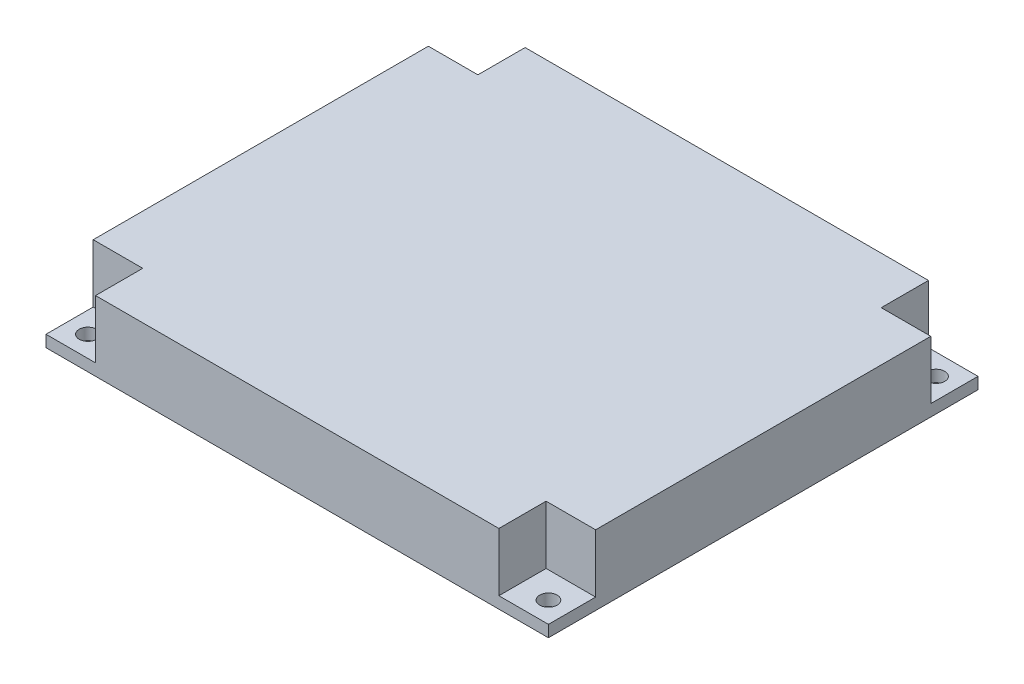
ISO-10303-21;
HEADER;
FILE_DESCRIPTION(('STEP AP214'),'2;1');
FILE_NAME('part.step','',(''),(''),'','','');
FILE_SCHEMA(('AUTOMOTIVE_DESIGN { 1 0 10303 214 1 1 1 1 }'));
ENDSEC;
DATA;
#1=APPLICATION_CONTEXT('core data for automotive mechanical design processes');
#2=APPLICATION_PROTOCOL_DEFINITION('international standard','automotive_design',2000,#1);
#3=PRODUCT_CONTEXT('',#1,'mechanical');
#4=PRODUCT('Part','Part','',(#3));
#5=PRODUCT_RELATED_PRODUCT_CATEGORY('part','',(#4));
#6=PRODUCT_DEFINITION_FORMATION('','',#4);
#7=PRODUCT_DEFINITION_CONTEXT('part definition',#1,'design');
#8=PRODUCT_DEFINITION('design','',#6,#7);
#9=PRODUCT_DEFINITION_SHAPE('','',#8);
#10=(LENGTH_UNIT() NAMED_UNIT(*) SI_UNIT(.MILLI.,.METRE.));
#11=(NAMED_UNIT(*) PLANE_ANGLE_UNIT() SI_UNIT($,.RADIAN.));
#12=(NAMED_UNIT(*) SI_UNIT($,.STERADIAN.) SOLID_ANGLE_UNIT());
#13=UNCERTAINTY_MEASURE_WITH_UNIT(LENGTH_MEASURE(1.E-05),#10,'distance_accuracy_value','');
#14=(GEOMETRIC_REPRESENTATION_CONTEXT(3) GLOBAL_UNCERTAINTY_ASSIGNED_CONTEXT((#13)) GLOBAL_UNIT_ASSIGNED_CONTEXT((#10,
#11,#12)) REPRESENTATION_CONTEXT('',''));
#15=CARTESIAN_POINT('',(0.,0.,0.));
#16=DIRECTION('',(0.,0.,1.));
#17=DIRECTION('',(1.,0.,0.));
#18=AXIS2_PLACEMENT_3D('',#15,#16,#17);
#19=CARTESIAN_POINT('',(0.,2.,0.));
#20=DIRECTION('',(0.,1.,0.));
#21=DIRECTION('',(0.,0.,1.));
#22=AXIS2_PLACEMENT_3D('',#19,#20,#21);
#23=PLANE('',#22);
#24=DIRECTION('',(0.,0.,1.));
#25=VECTOR('',#24,1.);
#26=CARTESIAN_POINT('',(-34.6,2.,28.75));
#27=LINE('',#26,#25);
#28=CARTESIAN_POINT('',(-34.6,2.,28.75));
#29=VERTEX_POINT('',#28);
#30=CARTESIAN_POINT('',(-34.6,2.,36.85));
#31=VERTEX_POINT('',#30);
#32=EDGE_CURVE('E50',#29,#31,#27,.T.);
#33=ORIENTED_EDGE('',*,*,#32,.F.);
#34=DIRECTION('',(1.,0.,0.));
#35=VECTOR('',#34,1.);
#36=CARTESIAN_POINT('',(-43.1,2.,28.75));
#37=LINE('',#36,#35);
#38=CARTESIAN_POINT('',(-43.1,2.,28.75));
#39=VERTEX_POINT('',#38);
#40=EDGE_CURVE('E267',#39,#29,#37,.T.);
#41=ORIENTED_EDGE('',*,*,#40,.F.);
#42=DIRECTION('',(0.,0.,1.));
#43=VECTOR('',#42,1.);
#44=CARTESIAN_POINT('',(-43.1,2.,-36.85));
#45=LINE('',#44,#43);
#46=CARTESIAN_POINT('',(-43.1,2.,36.85));
#47=VERTEX_POINT('',#46);
#48=EDGE_CURVE('E208',#39,#47,#45,.T.);
#49=ORIENTED_EDGE('',*,*,#48,.T.);
#50=DIRECTION('',(1.,0.,0.));
#51=VECTOR('',#50,1.);
#52=CARTESIAN_POINT('',(-43.1,2.,36.85));
#53=LINE('',#52,#51);
#54=EDGE_CURVE('E212',#47,#31,#53,.T.);
#55=ORIENTED_EDGE('',*,*,#54,.T.);
#56=EDGE_LOOP('',(#33,#41,#49,#55));
#57=FACE_BOUND('',#56,.T.);
#58=CARTESIAN_POINT('',(-39.5,2.,33.25));
#59=DIRECTION('',(0.,1.,0.));
#60=DIRECTION('',(0.,0.,1.));
#61=AXIS2_PLACEMENT_3D('',#58,#59,#60);
#62=CIRCLE('',#61,1.5);
#63=CARTESIAN_POINT('',(-39.5,2.,34.75));
#64=VERTEX_POINT('',#63);
#65=EDGE_CURVE('E184',#64,#64,#62,.T.);
#66=ORIENTED_EDGE('',*,*,#65,.F.);
#67=EDGE_LOOP('',(#66));
#68=FACE_BOUND('',#67,.T.);
#69=ADVANCED_FACE('F35',(#57,#68),#23,.T.);
#70=DIRECTION('',(-1.,0.,0.));
#71=VECTOR('',#70,1.);
#72=CARTESIAN_POINT('',(-43.1,2.,-28.75));
#73=LINE('',#72,#71);
#74=CARTESIAN_POINT('',(-34.6,2.,-28.75));
#75=VERTEX_POINT('',#74);
#76=CARTESIAN_POINT('',(-43.1,2.,-28.75));
#77=VERTEX_POINT('',#76);
#78=EDGE_CURVE('E58',#75,#77,#73,.T.);
#79=ORIENTED_EDGE('',*,*,#78,.F.);
#80=DIRECTION('',(0.,0.,1.));
#81=VECTOR('',#80,1.);
#82=CARTESIAN_POINT('',(-34.6,2.,-36.85));
#83=LINE('',#82,#81);
#84=CARTESIAN_POINT('',(-34.6,2.,-36.85));
#85=VERTEX_POINT('',#84);
#86=EDGE_CURVE('E264',#85,#75,#83,.T.);
#87=ORIENTED_EDGE('',*,*,#86,.F.);
#88=DIRECTION('',(-1.,0.,0.));
#89=VECTOR('',#88,1.);
#90=CARTESIAN_POINT('',(-43.1,2.,-36.85));
#91=LINE('',#90,#89);
#92=CARTESIAN_POINT('',(-43.1,2.,-36.85));
#93=VERTEX_POINT('',#92);
#94=EDGE_CURVE('E204',#85,#93,#91,.T.);
#95=ORIENTED_EDGE('',*,*,#94,.T.);
#96=EDGE_CURVE('E209',#93,#77,#45,.T.);
#97=ORIENTED_EDGE('',*,*,#96,.T.);
#98=EDGE_LOOP('',(#79,#87,#95,#97));
#99=FACE_BOUND('',#98,.T.);
#100=CARTESIAN_POINT('',(-39.5,2.,-33.25));
#101=DIRECTION('',(0.,1.,0.));
#102=DIRECTION('',(0.,0.,1.));
#103=AXIS2_PLACEMENT_3D('',#100,#101,#102);
#104=CIRCLE('',#103,1.5);
#105=CARTESIAN_POINT('',(-39.5,2.,-31.75));
#106=VERTEX_POINT('',#105);
#107=EDGE_CURVE('E196',#106,#106,#104,.T.);
#108=ORIENTED_EDGE('',*,*,#107,.F.);
#109=EDGE_LOOP('',(#108));
#110=FACE_BOUND('',#109,.T.);
#111=ADVANCED_FACE('F353',(#99,#110),#23,.T.);
#112=DIRECTION('',(0.,0.,-1.));
#113=VECTOR('',#112,1.);
#114=CARTESIAN_POINT('',(34.6,2.,-36.85));
#115=LINE('',#114,#113);
#116=CARTESIAN_POINT('',(34.6,2.,-28.75));
#117=VERTEX_POINT('',#116);
#118=CARTESIAN_POINT('',(34.6,2.,-36.85));
#119=VERTEX_POINT('',#118);
#120=EDGE_CURVE('E257',#117,#119,#115,.T.);
#121=ORIENTED_EDGE('',*,*,#120,.F.);
#122=DIRECTION('',(-1.,0.,0.));
#123=VECTOR('',#122,1.);
#124=CARTESIAN_POINT('',(34.6,2.,-28.75));
#125=LINE('',#124,#123);
#126=CARTESIAN_POINT('',(43.1,2.,-28.75));
#127=VERTEX_POINT('',#126);
#128=EDGE_CURVE('E254',#127,#117,#125,.T.);
#129=ORIENTED_EDGE('',*,*,#128,.F.);
#130=DIRECTION('',(0.,0.,-1.));
#131=VECTOR('',#130,1.);
#132=CARTESIAN_POINT('',(43.1,2.,-36.85));
#133=LINE('',#132,#131);
#134=CARTESIAN_POINT('',(43.1,2.,-36.85));
#135=VERTEX_POINT('',#134);
#136=EDGE_CURVE('E205',#127,#135,#133,.T.);
#137=ORIENTED_EDGE('',*,*,#136,.T.);
#138=EDGE_CURVE('E206',#135,#119,#91,.T.);
#139=ORIENTED_EDGE('',*,*,#138,.T.);
#140=EDGE_LOOP('',(#121,#129,#137,#139));
#141=FACE_BOUND('',#140,.T.);
#142=CARTESIAN_POINT('',(39.5,2.,-33.25));
#143=DIRECTION('',(0.,1.,0.));
#144=DIRECTION('',(0.,0.,1.));
#145=AXIS2_PLACEMENT_3D('',#142,#143,#144);
#146=CIRCLE('',#145,1.5);
#147=CARTESIAN_POINT('',(39.5,2.,-31.75));
#148=VERTEX_POINT('',#147);
#149=EDGE_CURVE('E190',#148,#148,#146,.T.);
#150=ORIENTED_EDGE('',*,*,#149,.F.);
#151=EDGE_LOOP('',(#150));
#152=FACE_BOUND('',#151,.T.);
#153=ADVANCED_FACE('F304',(#141,#152),#23,.T.);
#154=DIRECTION('',(0.,0.,-1.));
#155=VECTOR('',#154,1.);
#156=CARTESIAN_POINT('',(34.6,2.,28.75));
#157=LINE('',#156,#155);
#158=CARTESIAN_POINT('',(34.6,2.,36.85));
#159=VERTEX_POINT('',#158);
#160=CARTESIAN_POINT('',(34.6,2.,28.75));
#161=VERTEX_POINT('',#160);
#162=EDGE_CURVE('E171',#159,#161,#157,.T.);
#163=ORIENTED_EDGE('',*,*,#162,.F.);
#164=CARTESIAN_POINT('',(43.1,2.,36.85));
#165=VERTEX_POINT('',#164);
#166=EDGE_CURVE('E211',#159,#165,#53,.T.);
#167=ORIENTED_EDGE('',*,*,#166,.T.);
#168=CARTESIAN_POINT('',(43.1,2.,28.75));
#169=VERTEX_POINT('',#168);
#170=EDGE_CURVE('E202',#165,#169,#133,.T.);
#171=ORIENTED_EDGE('',*,*,#170,.T.);
#172=DIRECTION('',(1.,0.,0.));
#173=VECTOR('',#172,1.);
#174=CARTESIAN_POINT('',(34.6,2.,28.75));
#175=LINE('',#174,#173);
#176=EDGE_CURVE('E253',#161,#169,#175,.T.);
#177=ORIENTED_EDGE('',*,*,#176,.F.);
#178=EDGE_LOOP('',(#163,#167,#171,#177));
#179=FACE_BOUND('',#178,.T.);
#180=CARTESIAN_POINT('',(39.5,2.,33.25));
#181=DIRECTION('',(0.,1.,0.));
#182=DIRECTION('',(0.,0.,1.));
#183=AXIS2_PLACEMENT_3D('',#180,#181,#182);
#184=CIRCLE('',#183,1.5);
#185=CARTESIAN_POINT('',(39.5,2.,34.75));
#186=VERTEX_POINT('',#185);
#187=EDGE_CURVE('E175',#186,#186,#184,.T.);
#188=ORIENTED_EDGE('',*,*,#187,.F.);
#189=EDGE_LOOP('',(#188));
#190=FACE_BOUND('',#189,.T.);
#191=ADVANCED_FACE('F251',(#179,#190),#23,.T.);
#192=CARTESIAN_POINT('',(0.,0.,0.));
#193=DIRECTION('',(0.,1.,0.));
#194=DIRECTION('',(0.,0.,1.));
#195=AXIS2_PLACEMENT_3D('',#192,#193,#194);
#196=PLANE('',#195);
#197=DIRECTION('',(0.,0.,-1.));
#198=VECTOR('',#197,1.);
#199=CARTESIAN_POINT('',(43.1,0.,-36.85));
#200=LINE('',#199,#198);
#201=CARTESIAN_POINT('',(43.1,0.,36.85));
#202=VERTEX_POINT('',#201);
#203=CARTESIAN_POINT('',(43.1,0.,-36.85));
#204=VERTEX_POINT('',#203);
#205=EDGE_CURVE('E199',#202,#204,#200,.T.);
#206=ORIENTED_EDGE('',*,*,#205,.F.);
#207=DIRECTION('',(1.,0.,0.));
#208=VECTOR('',#207,1.);
#209=CARTESIAN_POINT('',(-43.1,0.,36.85));
#210=LINE('',#209,#208);
#211=CARTESIAN_POINT('',(-43.1,0.,36.85));
#212=VERTEX_POINT('',#211);
#213=EDGE_CURVE('E221',#212,#202,#210,.T.);
#214=ORIENTED_EDGE('',*,*,#213,.F.);
#215=DIRECTION('',(0.,0.,1.));
#216=VECTOR('',#215,1.);
#217=CARTESIAN_POINT('',(-43.1,0.,-36.85));
#218=LINE('',#217,#216);
#219=CARTESIAN_POINT('',(-43.1,0.,-36.85));
#220=VERTEX_POINT('',#219);
#221=EDGE_CURVE('E219',#220,#212,#218,.T.);
#222=ORIENTED_EDGE('',*,*,#221,.F.);
#223=DIRECTION('',(-1.,0.,0.));
#224=VECTOR('',#223,1.);
#225=CARTESIAN_POINT('',(-43.1,0.,-36.85));
#226=LINE('',#225,#224);
#227=EDGE_CURVE('E217',#204,#220,#226,.T.);
#228=ORIENTED_EDGE('',*,*,#227,.F.);
#229=EDGE_LOOP('',(#206,#214,#222,#228));
#230=FACE_BOUND('',#229,.T.);
#231=CARTESIAN_POINT('',(-39.5,0.,-33.25));
#232=DIRECTION('',(0.,1.,0.));
#233=DIRECTION('',(0.,0.,1.));
#234=AXIS2_PLACEMENT_3D('',#231,#232,#233);
#235=CIRCLE('',#234,1.5);
#236=CARTESIAN_POINT('',(-39.5,0.,-31.75));
#237=VERTEX_POINT('',#236);
#238=EDGE_CURVE('E193',#237,#237,#235,.T.);
#239=ORIENTED_EDGE('',*,*,#238,.T.);
#240=EDGE_LOOP('',(#239));
#241=FACE_BOUND('',#240,.T.);
#242=CARTESIAN_POINT('',(39.5,0.,-33.25));
#243=DIRECTION('',(0.,1.,0.));
#244=DIRECTION('',(0.,0.,1.));
#245=AXIS2_PLACEMENT_3D('',#242,#243,#244);
#246=CIRCLE('',#245,1.5);
#247=CARTESIAN_POINT('',(39.5,0.,-31.75));
#248=VERTEX_POINT('',#247);
#249=EDGE_CURVE('E187',#248,#248,#246,.T.);
#250=ORIENTED_EDGE('',*,*,#249,.T.);
#251=EDGE_LOOP('',(#250));
#252=FACE_BOUND('',#251,.T.);
#253=CARTESIAN_POINT('',(-39.5,0.,33.25));
#254=DIRECTION('',(0.,1.,0.));
#255=DIRECTION('',(0.,0.,1.));
#256=AXIS2_PLACEMENT_3D('',#253,#254,#255);
#257=CIRCLE('',#256,1.5);
#258=CARTESIAN_POINT('',(-39.5,0.,34.75));
#259=VERTEX_POINT('',#258);
#260=EDGE_CURVE('E182',#259,#259,#257,.T.);
#261=ORIENTED_EDGE('',*,*,#260,.T.);
#262=EDGE_LOOP('',(#261));
#263=FACE_BOUND('',#262,.T.);
#264=CARTESIAN_POINT('',(39.5,0.,33.25));
#265=DIRECTION('',(0.,1.,0.));
#266=DIRECTION('',(0.,0.,1.));
#267=AXIS2_PLACEMENT_3D('',#264,#265,#266);
#268=CIRCLE('',#267,1.5);
#269=CARTESIAN_POINT('',(39.5,0.,34.75));
#270=VERTEX_POINT('',#269);
#271=EDGE_CURVE('E172',#270,#270,#268,.T.);
#272=ORIENTED_EDGE('',*,*,#271,.T.);
#273=EDGE_LOOP('',(#272));
#274=FACE_BOUND('',#273,.T.);
#275=ADVANCED_FACE('F240',(#230,#241,#252,#263,#274),#196,.F.);
#276=CARTESIAN_POINT('',(43.1,2.,-36.85));
#277=DIRECTION('',(-1.,0.,0.));
#278=DIRECTION('',(0.,0.,1.));
#279=AXIS2_PLACEMENT_3D('',#276,#277,#278);
#280=PLANE('',#279);
#281=ORIENTED_EDGE('',*,*,#205,.T.);
#282=DIRECTION('',(0.,-1.,0.));
#283=VECTOR('',#282,1.);
#284=CARTESIAN_POINT('',(43.1,2.,-36.85));
#285=LINE('',#284,#283);
#286=EDGE_CURVE('E11',#135,#204,#285,.T.);
#287=ORIENTED_EDGE('',*,*,#286,.F.);
#288=ORIENTED_EDGE('',*,*,#136,.F.);
#289=DIRECTION('',(0.,-1.,0.));
#290=VECTOR('',#289,1.);
#291=CARTESIAN_POINT('',(43.1,12.,-28.75));
#292=LINE('',#291,#290);
#293=CARTESIAN_POINT('',(43.1,12.,-28.75));
#294=VERTEX_POINT('',#293);
#295=EDGE_CURVE('E177',#294,#127,#292,.T.);
#296=ORIENTED_EDGE('',*,*,#295,.F.);
#297=DIRECTION('',(0.,0.,-1.));
#298=VECTOR('',#297,1.);
#299=CARTESIAN_POINT('',(43.1,12.,-28.75));
#300=LINE('',#299,#298);
#301=CARTESIAN_POINT('',(43.1,12.,28.75));
#302=VERTEX_POINT('',#301);
#303=EDGE_CURVE('E159',#302,#294,#300,.T.);
#304=ORIENTED_EDGE('',*,*,#303,.F.);
#305=DIRECTION('',(0.,-1.,0.));
#306=VECTOR('',#305,1.);
#307=CARTESIAN_POINT('',(43.1,12.,28.75));
#308=LINE('',#307,#306);
#309=EDGE_CURVE('E156',#302,#169,#308,.T.);
#310=ORIENTED_EDGE('',*,*,#309,.T.);
#311=ORIENTED_EDGE('',*,*,#170,.F.);
#312=DIRECTION('',(0.,-1.,0.));
#313=VECTOR('',#312,1.);
#314=CARTESIAN_POINT('',(43.1,2.,36.85));
#315=LINE('',#314,#313);
#316=EDGE_CURVE('E214',#165,#202,#315,.T.);
#317=ORIENTED_EDGE('',*,*,#316,.T.);
#318=EDGE_LOOP('',(#281,#287,#288,#296,#304,#310,#311,#317));
#319=FACE_BOUND('',#318,.T.);
#320=ADVANCED_FACE('F37',(#319),#280,.F.);
#321=CARTESIAN_POINT('',(-43.1,2.,-36.85));
#322=DIRECTION('',(0.,0.,1.));
#323=DIRECTION('',(1.,0.,0.));
#324=AXIS2_PLACEMENT_3D('',#321,#322,#323);
#325=PLANE('',#324);
#326=ORIENTED_EDGE('',*,*,#227,.T.);
#327=DIRECTION('',(0.,-1.,0.));
#328=VECTOR('',#327,1.);
#329=CARTESIAN_POINT('',(-43.1,2.,-36.85));
#330=LINE('',#329,#328);
#331=EDGE_CURVE('E43',#93,#220,#330,.T.);
#332=ORIENTED_EDGE('',*,*,#331,.F.);
#333=ORIENTED_EDGE('',*,*,#94,.F.);
#334=DIRECTION('',(0.,-1.,0.));
#335=VECTOR('',#334,1.);
#336=CARTESIAN_POINT('',(-34.6,12.,-36.85));
#337=LINE('',#336,#335);
#338=CARTESIAN_POINT('',(-34.6,12.,-36.85));
#339=VERTEX_POINT('',#338);
#340=EDGE_CURVE('E286',#339,#85,#337,.T.);
#341=ORIENTED_EDGE('',*,*,#340,.F.);
#342=DIRECTION('',(-1.,0.,0.));
#343=VECTOR('',#342,1.);
#344=CARTESIAN_POINT('',(-34.6,12.,-36.85));
#345=LINE('',#344,#343);
#346=CARTESIAN_POINT('',(34.6,12.,-36.85));
#347=VERTEX_POINT('',#346);
#348=EDGE_CURVE('E310',#347,#339,#345,.T.);
#349=ORIENTED_EDGE('',*,*,#348,.F.);
#350=DIRECTION('',(0.,-1.,0.));
#351=VECTOR('',#350,1.);
#352=CARTESIAN_POINT('',(34.6,12.,-36.85));
#353=LINE('',#352,#351);
#354=EDGE_CURVE('E289',#347,#119,#353,.T.);
#355=ORIENTED_EDGE('',*,*,#354,.T.);
#356=ORIENTED_EDGE('',*,*,#138,.F.);
#357=ORIENTED_EDGE('',*,*,#286,.T.);
#358=EDGE_LOOP('',(#326,#332,#333,#341,#349,#355,#356,#357));
#359=FACE_BOUND('',#358,.T.);
#360=ADVANCED_FACE('F306',(#359),#325,.F.);
#361=CARTESIAN_POINT('',(-43.1,2.,-36.85));
#362=DIRECTION('',(1.,0.,0.));
#363=DIRECTION('',(0.,0.,-1.));
#364=AXIS2_PLACEMENT_3D('',#361,#362,#363);
#365=PLANE('',#364);
#366=ORIENTED_EDGE('',*,*,#221,.T.);
#367=DIRECTION('',(0.,-1.,0.));
#368=VECTOR('',#367,1.);
#369=CARTESIAN_POINT('',(-43.1,2.,36.85));
#370=LINE('',#369,#368);
#371=EDGE_CURVE('E225',#47,#212,#370,.T.);
#372=ORIENTED_EDGE('',*,*,#371,.F.);
#373=ORIENTED_EDGE('',*,*,#48,.F.);
#374=DIRECTION('',(0.,-1.,0.));
#375=VECTOR('',#374,1.);
#376=CARTESIAN_POINT('',(-43.1,12.,28.75));
#377=LINE('',#376,#375);
#378=CARTESIAN_POINT('',(-43.1,12.,28.75));
#379=VERTEX_POINT('',#378);
#380=EDGE_CURVE('E278',#379,#39,#377,.T.);
#381=ORIENTED_EDGE('',*,*,#380,.F.);
#382=DIRECTION('',(0.,0.,1.));
#383=VECTOR('',#382,1.);
#384=CARTESIAN_POINT('',(-43.1,12.,-28.75));
#385=LINE('',#384,#383);
#386=CARTESIAN_POINT('',(-43.1,12.,-28.75));
#387=VERTEX_POINT('',#386);
#388=EDGE_CURVE('E324',#387,#379,#385,.T.);
#389=ORIENTED_EDGE('',*,*,#388,.F.);
#390=DIRECTION('',(0.,-1.,0.));
#391=VECTOR('',#390,1.);
#392=CARTESIAN_POINT('',(-43.1,12.,-28.75));
#393=LINE('',#392,#391);
#394=EDGE_CURVE('E281',#387,#77,#393,.T.);
#395=ORIENTED_EDGE('',*,*,#394,.T.);
#396=ORIENTED_EDGE('',*,*,#96,.F.);
#397=ORIENTED_EDGE('',*,*,#331,.T.);
#398=EDGE_LOOP('',(#366,#372,#373,#381,#389,#395,#396,#397));
#399=FACE_BOUND('',#398,.T.);
#400=ADVANCED_FACE('F232',(#399),#365,.F.);
#401=CARTESIAN_POINT('',(-43.1,2.,36.85));
#402=DIRECTION('',(0.,0.,-1.));
#403=DIRECTION('',(-1.,0.,0.));
#404=AXIS2_PLACEMENT_3D('',#401,#402,#403);
#405=PLANE('',#404);
#406=ORIENTED_EDGE('',*,*,#213,.T.);
#407=ORIENTED_EDGE('',*,*,#316,.F.);
#408=ORIENTED_EDGE('',*,*,#166,.F.);
#409=DIRECTION('',(0.,-1.,0.));
#410=VECTOR('',#409,1.);
#411=CARTESIAN_POINT('',(34.6,12.,36.85));
#412=LINE('',#411,#410);
#413=CARTESIAN_POINT('',(34.6,12.,36.85));
#414=VERTEX_POINT('',#413);
#415=EDGE_CURVE('E270',#414,#159,#412,.T.);
#416=ORIENTED_EDGE('',*,*,#415,.F.);
#417=DIRECTION('',(1.,0.,0.));
#418=VECTOR('',#417,1.);
#419=CARTESIAN_POINT('',(-34.6,12.,36.85));
#420=LINE('',#419,#418);
#421=CARTESIAN_POINT('',(-34.6,12.,36.85));
#422=VERTEX_POINT('',#421);
#423=EDGE_CURVE('E165',#422,#414,#420,.T.);
#424=ORIENTED_EDGE('',*,*,#423,.F.);
#425=DIRECTION('',(0.,-1.,0.));
#426=VECTOR('',#425,1.);
#427=CARTESIAN_POINT('',(-34.6,12.,36.85));
#428=LINE('',#427,#426);
#429=EDGE_CURVE('E272',#422,#31,#428,.T.);
#430=ORIENTED_EDGE('',*,*,#429,.T.);
#431=ORIENTED_EDGE('',*,*,#54,.F.);
#432=ORIENTED_EDGE('',*,*,#371,.T.);
#433=EDGE_LOOP('',(#406,#407,#408,#416,#424,#430,#431,#432));
#434=FACE_BOUND('',#433,.T.);
#435=ADVANCED_FACE('F244',(#434),#405,.F.);
#436=CARTESIAN_POINT('',(-39.5,2.,-33.25));
#437=DIRECTION('',(0.,-1.,0.));
#438=DIRECTION('',(0.,0.,-1.));
#439=AXIS2_PLACEMENT_3D('',#436,#437,#438);
#440=CYLINDRICAL_SURFACE('',#439,1.5);
#441=ORIENTED_EDGE('',*,*,#107,.T.);
#442=EDGE_LOOP('',(#441));
#443=FACE_BOUND('',#442,.T.);
#444=ORIENTED_EDGE('',*,*,#238,.F.);
#445=EDGE_LOOP('',(#444));
#446=FACE_BOUND('',#445,.T.);
#447=ADVANCED_FACE('F407',(#443,#446),#440,.F.);
#448=CARTESIAN_POINT('',(39.5,2.,-33.25));
#449=DIRECTION('',(0.,-1.,0.));
#450=DIRECTION('',(0.,0.,-1.));
#451=AXIS2_PLACEMENT_3D('',#448,#449,#450);
#452=CYLINDRICAL_SURFACE('',#451,1.5);
#453=ORIENTED_EDGE('',*,*,#149,.T.);
#454=EDGE_LOOP('',(#453));
#455=FACE_BOUND('',#454,.T.);
#456=ORIENTED_EDGE('',*,*,#249,.F.);
#457=EDGE_LOOP('',(#456));
#458=FACE_BOUND('',#457,.T.);
#459=ADVANCED_FACE('F397',(#455,#458),#452,.F.);
#460=CARTESIAN_POINT('',(-39.5,2.,33.25));
#461=DIRECTION('',(0.,-1.,0.));
#462=DIRECTION('',(0.,0.,-1.));
#463=AXIS2_PLACEMENT_3D('',#460,#461,#462);
#464=CYLINDRICAL_SURFACE('',#463,1.5);
#465=ORIENTED_EDGE('',*,*,#65,.T.);
#466=EDGE_LOOP('',(#465));
#467=FACE_BOUND('',#466,.T.);
#468=ORIENTED_EDGE('',*,*,#260,.F.);
#469=EDGE_LOOP('',(#468));
#470=FACE_BOUND('',#469,.T.);
#471=ADVANCED_FACE('F386',(#467,#470),#464,.F.);
#472=CARTESIAN_POINT('',(39.5,2.,33.25));
#473=DIRECTION('',(0.,-1.,0.));
#474=DIRECTION('',(0.,0.,-1.));
#475=AXIS2_PLACEMENT_3D('',#472,#473,#474);
#476=CYLINDRICAL_SURFACE('',#475,1.5);
#477=ORIENTED_EDGE('',*,*,#187,.T.);
#478=EDGE_LOOP('',(#477));
#479=FACE_BOUND('',#478,.T.);
#480=ORIENTED_EDGE('',*,*,#271,.F.);
#481=EDGE_LOOP('',(#480));
#482=FACE_BOUND('',#481,.T.);
#483=ADVANCED_FACE('F381',(#479,#482),#476,.F.);
#484=CARTESIAN_POINT('',(34.6,12.,28.75));
#485=DIRECTION('',(-1.,0.,0.));
#486=DIRECTION('',(0.,0.,1.));
#487=AXIS2_PLACEMENT_3D('',#484,#485,#486);
#488=PLANE('',#487);
#489=ORIENTED_EDGE('',*,*,#162,.T.);
#490=DIRECTION('',(0.,-1.,0.));
#491=VECTOR('',#490,1.);
#492=CARTESIAN_POINT('',(34.6,12.,28.75));
#493=LINE('',#492,#491);
#494=CARTESIAN_POINT('',(34.6,12.,28.75));
#495=VERTEX_POINT('',#494);
#496=EDGE_CURVE('E153',#495,#161,#493,.T.);
#497=ORIENTED_EDGE('',*,*,#496,.F.);
#498=DIRECTION('',(0.,0.,-1.));
#499=VECTOR('',#498,1.);
#500=CARTESIAN_POINT('',(34.6,12.,28.75));
#501=LINE('',#500,#499);
#502=EDGE_CURVE('E160',#414,#495,#501,.T.);
#503=ORIENTED_EDGE('',*,*,#502,.F.);
#504=ORIENTED_EDGE('',*,*,#415,.T.);
#505=EDGE_LOOP('',(#489,#497,#503,#504));
#506=FACE_BOUND('',#505,.T.);
#507=ADVANCED_FACE('F170',(#506),#488,.F.);
#508=CARTESIAN_POINT('',(34.6,12.,28.75));
#509=DIRECTION('',(0.,0.,-1.));
#510=DIRECTION('',(-1.,0.,0.));
#511=AXIS2_PLACEMENT_3D('',#508,#509,#510);
#512=PLANE('',#511);
#513=ORIENTED_EDGE('',*,*,#176,.T.);
#514=ORIENTED_EDGE('',*,*,#309,.F.);
#515=DIRECTION('',(1.,0.,0.));
#516=VECTOR('',#515,1.);
#517=CARTESIAN_POINT('',(34.6,12.,28.75));
#518=LINE('',#517,#516);
#519=EDGE_CURVE('E148',#495,#302,#518,.T.);
#520=ORIENTED_EDGE('',*,*,#519,.F.);
#521=ORIENTED_EDGE('',*,*,#496,.T.);
#522=EDGE_LOOP('',(#513,#514,#520,#521));
#523=FACE_BOUND('',#522,.T.);
#524=ADVANCED_FACE('F151',(#523),#512,.F.);
#525=CARTESIAN_POINT('',(34.6,12.,-28.75));
#526=DIRECTION('',(0.,0.,1.));
#527=DIRECTION('',(1.,0.,0.));
#528=AXIS2_PLACEMENT_3D('',#525,#526,#527);
#529=PLANE('',#528);
#530=ORIENTED_EDGE('',*,*,#128,.T.);
#531=DIRECTION('',(0.,-1.,0.));
#532=VECTOR('',#531,1.);
#533=CARTESIAN_POINT('',(34.6,12.,-28.75));
#534=LINE('',#533,#532);
#535=CARTESIAN_POINT('',(34.6,12.,-28.75));
#536=VERTEX_POINT('',#535);
#537=EDGE_CURVE('E292',#536,#117,#534,.T.);
#538=ORIENTED_EDGE('',*,*,#537,.F.);
#539=DIRECTION('',(-1.,0.,0.));
#540=VECTOR('',#539,1.);
#541=CARTESIAN_POINT('',(34.6,12.,-28.75));
#542=LINE('',#541,#540);
#543=EDGE_CURVE('E300',#294,#536,#542,.T.);
#544=ORIENTED_EDGE('',*,*,#543,.F.);
#545=ORIENTED_EDGE('',*,*,#295,.T.);
#546=EDGE_LOOP('',(#530,#538,#544,#545));
#547=FACE_BOUND('',#546,.T.);
#548=ADVANCED_FACE('F298',(#547),#529,.F.);
#549=CARTESIAN_POINT('',(34.6,12.,-36.85));
#550=DIRECTION('',(-1.,0.,0.));
#551=DIRECTION('',(0.,0.,1.));
#552=AXIS2_PLACEMENT_3D('',#549,#550,#551);
#553=PLANE('',#552);
#554=ORIENTED_EDGE('',*,*,#120,.T.);
#555=ORIENTED_EDGE('',*,*,#354,.F.);
#556=DIRECTION('',(0.,0.,-1.));
#557=VECTOR('',#556,1.);
#558=CARTESIAN_POINT('',(34.6,12.,-36.85));
#559=LINE('',#558,#557);
#560=EDGE_CURVE('E314',#536,#347,#559,.T.);
#561=ORIENTED_EDGE('',*,*,#560,.F.);
#562=ORIENTED_EDGE('',*,*,#537,.T.);
#563=EDGE_LOOP('',(#554,#555,#561,#562));
#564=FACE_BOUND('',#563,.T.);
#565=ADVANCED_FACE('F313',(#564),#553,.F.);
#566=CARTESIAN_POINT('',(-34.6,12.,-36.85));
#567=DIRECTION('',(1.,0.,0.));
#568=DIRECTION('',(0.,0.,-1.));
#569=AXIS2_PLACEMENT_3D('',#566,#567,#568);
#570=PLANE('',#569);
#571=ORIENTED_EDGE('',*,*,#86,.T.);
#572=DIRECTION('',(0.,-1.,0.));
#573=VECTOR('',#572,1.);
#574=CARTESIAN_POINT('',(-34.6,12.,-28.75));
#575=LINE('',#574,#573);
#576=CARTESIAN_POINT('',(-34.6,12.,-28.75));
#577=VERTEX_POINT('',#576);
#578=EDGE_CURVE('E283',#577,#75,#575,.T.);
#579=ORIENTED_EDGE('',*,*,#578,.F.);
#580=DIRECTION('',(0.,0.,1.));
#581=VECTOR('',#580,1.);
#582=CARTESIAN_POINT('',(-34.6,12.,-36.85));
#583=LINE('',#582,#581);
#584=EDGE_CURVE('E316',#339,#577,#583,.T.);
#585=ORIENTED_EDGE('',*,*,#584,.F.);
#586=ORIENTED_EDGE('',*,*,#340,.T.);
#587=EDGE_LOOP('',(#571,#579,#585,#586));
#588=FACE_BOUND('',#587,.T.);
#589=ADVANCED_FACE('F349',(#588),#570,.F.);
#590=CARTESIAN_POINT('',(-43.1,12.,-28.75));
#591=DIRECTION('',(0.,0.,1.));
#592=DIRECTION('',(1.,0.,0.));
#593=AXIS2_PLACEMENT_3D('',#590,#591,#592);
#594=PLANE('',#593);
#595=ORIENTED_EDGE('',*,*,#78,.T.);
#596=ORIENTED_EDGE('',*,*,#394,.F.);
#597=DIRECTION('',(-1.,0.,0.));
#598=VECTOR('',#597,1.);
#599=CARTESIAN_POINT('',(-43.1,12.,-28.75));
#600=LINE('',#599,#598);
#601=EDGE_CURVE('E322',#577,#387,#600,.T.);
#602=ORIENTED_EDGE('',*,*,#601,.F.);
#603=ORIENTED_EDGE('',*,*,#578,.T.);
#604=EDGE_LOOP('',(#595,#596,#602,#603));
#605=FACE_BOUND('',#604,.T.);
#606=ADVANCED_FACE('F342',(#605),#594,.F.);
#607=CARTESIAN_POINT('',(-43.1,12.,28.75));
#608=DIRECTION('',(0.,0.,-1.));
#609=DIRECTION('',(-1.,0.,0.));
#610=AXIS2_PLACEMENT_3D('',#607,#608,#609);
#611=PLANE('',#610);
#612=ORIENTED_EDGE('',*,*,#40,.T.);
#613=DIRECTION('',(0.,-1.,0.));
#614=VECTOR('',#613,1.);
#615=CARTESIAN_POINT('',(-34.6,12.,28.75));
#616=LINE('',#615,#614);
#617=CARTESIAN_POINT('',(-34.6,12.,28.75));
#618=VERTEX_POINT('',#617);
#619=EDGE_CURVE('E275',#618,#29,#616,.T.);
#620=ORIENTED_EDGE('',*,*,#619,.F.);
#621=DIRECTION('',(1.,0.,0.));
#622=VECTOR('',#621,1.);
#623=CARTESIAN_POINT('',(-43.1,12.,28.75));
#624=LINE('',#623,#622);
#625=EDGE_CURVE('E326',#379,#618,#624,.T.);
#626=ORIENTED_EDGE('',*,*,#625,.F.);
#627=ORIENTED_EDGE('',*,*,#380,.T.);
#628=EDGE_LOOP('',(#612,#620,#626,#627));
#629=FACE_BOUND('',#628,.T.);
#630=ADVANCED_FACE('F340',(#629),#611,.F.);
#631=CARTESIAN_POINT('',(-34.6,12.,28.75));
#632=DIRECTION('',(1.,0.,0.));
#633=DIRECTION('',(0.,0.,-1.));
#634=AXIS2_PLACEMENT_3D('',#631,#632,#633);
#635=PLANE('',#634);
#636=ORIENTED_EDGE('',*,*,#32,.T.);
#637=ORIENTED_EDGE('',*,*,#429,.F.);
#638=DIRECTION('',(0.,0.,1.));
#639=VECTOR('',#638,1.);
#640=CARTESIAN_POINT('',(-34.6,12.,28.75));
#641=LINE('',#640,#639);
#642=EDGE_CURVE('E328',#618,#422,#641,.T.);
#643=ORIENTED_EDGE('',*,*,#642,.F.);
#644=ORIENTED_EDGE('',*,*,#619,.T.);
#645=EDGE_LOOP('',(#636,#637,#643,#644));
#646=FACE_BOUND('',#645,.T.);
#647=ADVANCED_FACE('F334',(#646),#635,.F.);
#648=CARTESIAN_POINT('',(0.,12.,0.));
#649=DIRECTION('',(0.,1.,0.));
#650=DIRECTION('',(0.,0.,1.));
#651=AXIS2_PLACEMENT_3D('',#648,#649,#650);
#652=PLANE('',#651);
#653=ORIENTED_EDGE('',*,*,#502,.T.);
#654=ORIENTED_EDGE('',*,*,#519,.T.);
#655=ORIENTED_EDGE('',*,*,#303,.T.);
#656=ORIENTED_EDGE('',*,*,#543,.T.);
#657=ORIENTED_EDGE('',*,*,#560,.T.);
#658=ORIENTED_EDGE('',*,*,#348,.T.);
#659=ORIENTED_EDGE('',*,*,#584,.T.);
#660=ORIENTED_EDGE('',*,*,#601,.T.);
#661=ORIENTED_EDGE('',*,*,#388,.T.);
#662=ORIENTED_EDGE('',*,*,#625,.T.);
#663=ORIENTED_EDGE('',*,*,#642,.T.);
#664=ORIENTED_EDGE('',*,*,#423,.T.);
#665=EDGE_LOOP('',(#653,#654,#655,#656,#657,#658,#659,#660,#661,#662,#663,#664));
#666=FACE_BOUND('',#665,.T.);
#667=ADVANCED_FACE('F163',(#666),#652,.T.);
#668=CLOSED_SHELL('',(#69,#111,#153,#191,#275,#320,#360,#400,#435,#447,#459,#471,#483,#507,#524,
#548,#565,#589,#606,#630,#647,#667));
#669=MANIFOLD_SOLID_BREP('B2',#668);
#670=ADVANCED_BREP_SHAPE_REPRESENTATION('',(#18,#669),#14);
#671=SHAPE_DEFINITION_REPRESENTATION(#9,#670);
ENDSEC;
END-ISO-10303-21;
